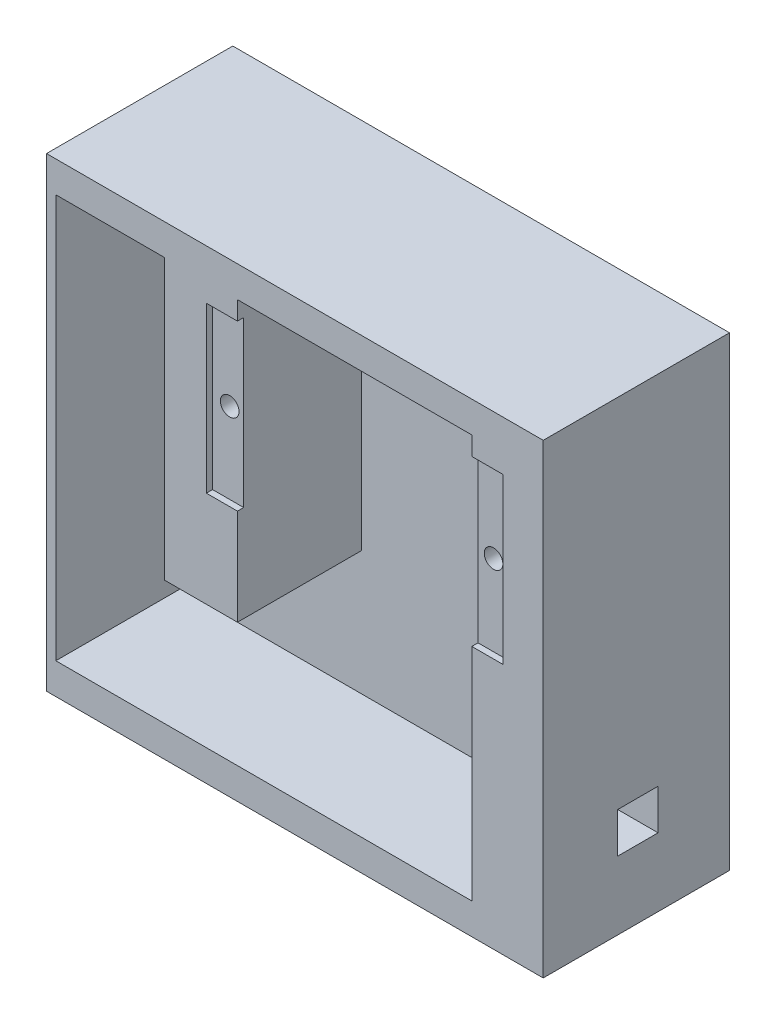
ISO-10303-21;
HEADER;
FILE_DESCRIPTION(('STEP AP214'),'2;1');
FILE_NAME('part.step','',(''),(''),'','','');
FILE_SCHEMA(('AUTOMOTIVE_DESIGN { 1 0 10303 214 1 1 1 1 }'));
ENDSEC;
DATA;
#1=APPLICATION_CONTEXT('core data for automotive mechanical design processes');
#2=APPLICATION_PROTOCOL_DEFINITION('international standard','automotive_design',2000,#1);
#3=PRODUCT_CONTEXT('',#1,'mechanical');
#4=PRODUCT('Part','Part','',(#3));
#5=PRODUCT_RELATED_PRODUCT_CATEGORY('part','',(#4));
#6=PRODUCT_DEFINITION_FORMATION('','',#4);
#7=PRODUCT_DEFINITION_CONTEXT('part definition',#1,'design');
#8=PRODUCT_DEFINITION('design','',#6,#7);
#9=PRODUCT_DEFINITION_SHAPE('','',#8);
#10=(LENGTH_UNIT() NAMED_UNIT(*) SI_UNIT(.MILLI.,.METRE.));
#11=(NAMED_UNIT(*) PLANE_ANGLE_UNIT() SI_UNIT($,.RADIAN.));
#12=(NAMED_UNIT(*) SI_UNIT($,.STERADIAN.) SOLID_ANGLE_UNIT());
#13=UNCERTAINTY_MEASURE_WITH_UNIT(LENGTH_MEASURE(1.E-05),#10,'distance_accuracy_value','');
#14=(GEOMETRIC_REPRESENTATION_CONTEXT(3) GLOBAL_UNCERTAINTY_ASSIGNED_CONTEXT((#13)) GLOBAL_UNIT_ASSIGNED_CONTEXT((#10,
#11,#12)) REPRESENTATION_CONTEXT('',''));
#15=CARTESIAN_POINT('',(0.,0.,0.));
#16=DIRECTION('',(0.,0.,1.));
#17=DIRECTION('',(1.,0.,0.));
#18=AXIS2_PLACEMENT_3D('',#15,#16,#17);
#19=CARTESIAN_POINT('',(-18.,-43.,-8.4852813742386));
#20=DIRECTION('',(0.,0.,1.));
#21=DIRECTION('',(1.,0.,0.));
#22=AXIS2_PLACEMENT_3D('',#19,#20,#21);
#23=CYLINDRICAL_SURFACE('',#22,3.);
#24=CARTESIAN_POINT('',(-18.,-43.,0.));
#25=DIRECTION('',(0.,0.,-1.));
#26=DIRECTION('',(-1.,0.,0.));
#27=AXIS2_PLACEMENT_3D('',#24,#25,#26);
#28=CIRCLE('',#27,3.);
#29=CARTESIAN_POINT('',(-21.,-43.,0.));
#30=VERTEX_POINT('',#29);
#31=EDGE_CURVE('E298',#30,#30,#28,.F.);
#32=ORIENTED_EDGE('',*,*,#31,.F.);
#33=EDGE_LOOP('',(#32));
#34=FACE_BOUND('',#33,.T.);
#35=CARTESIAN_POINT('',(-18.,-43.,58.));
#36=DIRECTION('',(0.,0.,1.));
#37=DIRECTION('',(1.,0.,0.));
#38=AXIS2_PLACEMENT_3D('',#35,#36,#37);
#39=CIRCLE('',#38,3.);
#40=CARTESIAN_POINT('',(-15.,-43.,58.));
#41=VERTEX_POINT('',#40);
#42=EDGE_CURVE('E38',#41,#41,#39,.F.);
#43=ORIENTED_EDGE('',*,*,#42,.F.);
#44=EDGE_LOOP('',(#43));
#45=FACE_BOUND('',#44,.T.);
#46=ADVANCED_FACE('F34',(#34,#45),#23,.F.);
#47=CARTESIAN_POINT('',(-103.,-43.,-8.4852813742386));
#48=DIRECTION('',(0.,0.,1.));
#49=DIRECTION('',(1.,0.,0.));
#50=AXIS2_PLACEMENT_3D('',#47,#48,#49);
#51=CYLINDRICAL_SURFACE('',#50,2.99999999999999);
#52=CARTESIAN_POINT('',(-103.,-43.,0.));
#53=DIRECTION('',(0.,0.,-1.));
#54=DIRECTION('',(-1.,0.,0.));
#55=AXIS2_PLACEMENT_3D('',#52,#53,#54);
#56=CIRCLE('',#55,2.99999999999999);
#57=CARTESIAN_POINT('',(-106.,-43.,0.));
#58=VERTEX_POINT('',#57);
#59=EDGE_CURVE('E305',#58,#58,#56,.F.);
#60=ORIENTED_EDGE('',*,*,#59,.F.);
#61=EDGE_LOOP('',(#60));
#62=FACE_BOUND('',#61,.T.);
#63=CARTESIAN_POINT('',(-103.,-43.,58.));
#64=DIRECTION('',(0.,0.,1.));
#65=DIRECTION('',(1.,0.,0.));
#66=AXIS2_PLACEMENT_3D('',#63,#64,#65);
#67=CIRCLE('',#66,2.99999999999999);
#68=CARTESIAN_POINT('',(-100.,-43.,58.));
#69=VERTEX_POINT('',#68);
#70=EDGE_CURVE('E254',#69,#69,#67,.F.);
#71=ORIENTED_EDGE('',*,*,#70,.F.);
#72=EDGE_LOOP('',(#71));
#73=FACE_BOUND('',#72,.T.);
#74=ADVANCED_FACE('F401',(#62,#73),#51,.F.);
#75=CARTESIAN_POINT('',(0.,0.,60.));
#76=DIRECTION('',(-1.,0.,0.));
#77=DIRECTION('',(0.,-1.,0.));
#78=AXIS2_PLACEMENT_3D('',#75,#76,#77);
#79=PLANE('',#78);
#80=DIRECTION('',(0.,0.,-1.));
#81=VECTOR('',#80,1.);
#82=CARTESIAN_POINT('',(0.,-128.,36.));
#83=LINE('',#82,#81);
#84=CARTESIAN_POINT('',(0.,-128.,36.));
#85=VERTEX_POINT('',#84);
#86=CARTESIAN_POINT('',(0.,-128.,23.));
#87=VERTEX_POINT('',#86);
#88=EDGE_CURVE('E286',#85,#87,#83,.T.);
#89=ORIENTED_EDGE('',*,*,#88,.F.);
#90=DIRECTION('',(0.,-1.,0.));
#91=VECTOR('',#90,1.);
#92=CARTESIAN_POINT('',(0.,-115.,36.));
#93=LINE('',#92,#91);
#94=CARTESIAN_POINT('',(0.,-115.,36.));
#95=VERTEX_POINT('',#94);
#96=EDGE_CURVE('E284',#95,#85,#93,.T.);
#97=ORIENTED_EDGE('',*,*,#96,.F.);
#98=DIRECTION('',(0.,0.,1.));
#99=VECTOR('',#98,1.);
#100=CARTESIAN_POINT('',(0.,-115.,36.));
#101=LINE('',#100,#99);
#102=CARTESIAN_POINT('',(0.,-115.,23.));
#103=VERTEX_POINT('',#102);
#104=EDGE_CURVE('E292',#103,#95,#101,.T.);
#105=ORIENTED_EDGE('',*,*,#104,.F.);
#106=DIRECTION('',(0.,1.,0.));
#107=VECTOR('',#106,1.);
#108=CARTESIAN_POINT('',(0.,-115.,23.));
#109=LINE('',#108,#107);
#110=EDGE_CURVE('E289',#87,#103,#109,.T.);
#111=ORIENTED_EDGE('',*,*,#110,.F.);
#112=EDGE_LOOP('',(#89,#97,#105,#111));
#113=FACE_BOUND('',#112,.T.);
#114=DIRECTION('',(0.,1.,0.));
#115=VECTOR('',#114,1.);
#116=CARTESIAN_POINT('',(0.,0.,0.));
#117=LINE('',#116,#115);
#118=CARTESIAN_POINT('',(0.,-150.,0.));
#119=VERTEX_POINT('',#118);
#120=CARTESIAN_POINT('',(0.,0.,0.));
#121=VERTEX_POINT('',#120);
#122=EDGE_CURVE('E345',#119,#121,#117,.T.);
#123=ORIENTED_EDGE('',*,*,#122,.T.);
#124=DIRECTION('',(0.,0.,-1.));
#125=VECTOR('',#124,1.);
#126=CARTESIAN_POINT('',(0.,0.,60.));
#127=LINE('',#126,#125);
#128=CARTESIAN_POINT('',(0.,0.,60.));
#129=VERTEX_POINT('',#128);
#130=EDGE_CURVE('E382',#129,#121,#127,.T.);
#131=ORIENTED_EDGE('',*,*,#130,.F.);
#132=DIRECTION('',(0.,1.,0.));
#133=VECTOR('',#132,1.);
#134=CARTESIAN_POINT('',(0.,0.,60.));
#135=LINE('',#134,#133);
#136=CARTESIAN_POINT('',(0.,-150.,60.));
#137=VERTEX_POINT('',#136);
#138=EDGE_CURVE('E356',#137,#129,#135,.T.);
#139=ORIENTED_EDGE('',*,*,#138,.F.);
#140=DIRECTION('',(0.,0.,-1.));
#141=VECTOR('',#140,1.);
#142=CARTESIAN_POINT('',(0.,-150.,60.));
#143=LINE('',#142,#141);
#144=EDGE_CURVE('E366',#137,#119,#143,.T.);
#145=ORIENTED_EDGE('',*,*,#144,.T.);
#146=EDGE_LOOP('',(#123,#131,#139,#145));
#147=FACE_BOUND('',#146,.T.);
#148=ADVANCED_FACE('F36',(#113,#147),#79,.F.);
#149=CARTESIAN_POINT('',(0.,0.,60.));
#150=DIRECTION('',(0.,-1.,0.));
#151=DIRECTION('',(1.,0.,0.));
#152=AXIS2_PLACEMENT_3D('',#149,#150,#151);
#153=PLANE('',#152);
#154=DIRECTION('',(-1.,0.,0.));
#155=VECTOR('',#154,1.);
#156=CARTESIAN_POINT('',(0.,0.,0.));
#157=LINE('',#156,#155);
#158=CARTESIAN_POINT('',(-160.,0.,0.));
#159=VERTEX_POINT('',#158);
#160=EDGE_CURVE('E369',#121,#159,#157,.T.);
#161=ORIENTED_EDGE('',*,*,#160,.T.);
#162=DIRECTION('',(0.,0.,-1.));
#163=VECTOR('',#162,1.);
#164=CARTESIAN_POINT('',(-160.,0.,60.));
#165=LINE('',#164,#163);
#166=CARTESIAN_POINT('',(-160.,0.,60.));
#167=VERTEX_POINT('',#166);
#168=EDGE_CURVE('E379',#167,#159,#165,.T.);
#169=ORIENTED_EDGE('',*,*,#168,.F.);
#170=DIRECTION('',(-1.,0.,0.));
#171=VECTOR('',#170,1.);
#172=CARTESIAN_POINT('',(0.,0.,60.));
#173=LINE('',#172,#171);
#174=EDGE_CURVE('E359',#129,#167,#173,.T.);
#175=ORIENTED_EDGE('',*,*,#174,.F.);
#176=ORIENTED_EDGE('',*,*,#130,.T.);
#177=EDGE_LOOP('',(#161,#169,#175,#176));
#178=FACE_BOUND('',#177,.T.);
#179=ADVANCED_FACE('F453',(#178),#153,.F.);
#180=CARTESIAN_POINT('',(-160.,0.,60.));
#181=DIRECTION('',(1.,0.,0.));
#182=DIRECTION('',(0.,1.,0.));
#183=AXIS2_PLACEMENT_3D('',#180,#181,#182);
#184=PLANE('',#183);
#185=DIRECTION('',(0.,-1.,0.));
#186=VECTOR('',#185,1.);
#187=CARTESIAN_POINT('',(-160.,0.,0.));
#188=LINE('',#187,#186);
#189=CARTESIAN_POINT('',(-160.,-150.,0.));
#190=VERTEX_POINT('',#189);
#191=EDGE_CURVE('E371',#159,#190,#188,.T.);
#192=ORIENTED_EDGE('',*,*,#191,.T.);
#193=DIRECTION('',(0.,0.,-1.));
#194=VECTOR('',#193,1.);
#195=CARTESIAN_POINT('',(-160.,-150.,60.));
#196=LINE('',#195,#194);
#197=CARTESIAN_POINT('',(-160.,-150.,60.));
#198=VERTEX_POINT('',#197);
#199=EDGE_CURVE('E376',#198,#190,#196,.T.);
#200=ORIENTED_EDGE('',*,*,#199,.F.);
#201=DIRECTION('',(0.,-1.,0.));
#202=VECTOR('',#201,1.);
#203=CARTESIAN_POINT('',(-160.,0.,60.));
#204=LINE('',#203,#202);
#205=EDGE_CURVE('E362',#167,#198,#204,.T.);
#206=ORIENTED_EDGE('',*,*,#205,.F.);
#207=ORIENTED_EDGE('',*,*,#168,.T.);
#208=EDGE_LOOP('',(#192,#200,#206,#207));
#209=FACE_BOUND('',#208,.T.);
#210=ADVANCED_FACE('F450',(#209),#184,.F.);
#211=CARTESIAN_POINT('',(0.,-150.,60.));
#212=DIRECTION('',(0.,1.,0.));
#213=DIRECTION('',(-1.,0.,0.));
#214=AXIS2_PLACEMENT_3D('',#211,#212,#213);
#215=PLANE('',#214);
#216=DIRECTION('',(1.,0.,0.));
#217=VECTOR('',#216,1.);
#218=CARTESIAN_POINT('',(0.,-150.,0.));
#219=LINE('',#218,#217);
#220=EDGE_CURVE('E360',#190,#119,#219,.T.);
#221=ORIENTED_EDGE('',*,*,#220,.T.);
#222=ORIENTED_EDGE('',*,*,#144,.F.);
#223=DIRECTION('',(1.,0.,0.));
#224=VECTOR('',#223,1.);
#225=CARTESIAN_POINT('',(0.,-150.,60.));
#226=LINE('',#225,#224);
#227=EDGE_CURVE('E364',#198,#137,#226,.T.);
#228=ORIENTED_EDGE('',*,*,#227,.F.);
#229=ORIENTED_EDGE('',*,*,#199,.T.);
#230=EDGE_LOOP('',(#221,#222,#228,#229));
#231=FACE_BOUND('',#230,.T.);
#232=ADVANCED_FACE('F443',(#231),#215,.F.);
#233=CARTESIAN_POINT('',(0.,0.,60.));
#234=DIRECTION('',(0.,0.,-1.));
#235=DIRECTION('',(-1.,0.,0.));
#236=AXIS2_PLACEMENT_3D('',#233,#234,#235);
#237=PLANE('',#236);
#238=DIRECTION('',(0.,-1.,0.));
#239=VECTOR('',#238,1.);
#240=CARTESIAN_POINT('',(-157.,-100.,60.));
#241=LINE('',#240,#239);
#242=CARTESIAN_POINT('',(-157.,-10.,60.));
#243=VERTEX_POINT('',#242);
#244=CARTESIAN_POINT('',(-157.,-140.,60.));
#245=VERTEX_POINT('',#244);
#246=EDGE_CURVE('E332',#243,#245,#241,.T.);
#247=ORIENTED_EDGE('',*,*,#246,.F.);
#248=DIRECTION('',(-1.,0.,0.));
#249=VECTOR('',#248,1.);
#250=CARTESIAN_POINT('',(-157.,-10.,60.));
#251=LINE('',#250,#249);
#252=CARTESIAN_POINT('',(-122.,-10.,60.));
#253=VERTEX_POINT('',#252);
#254=EDGE_CURVE('E211',#253,#243,#251,.T.);
#255=ORIENTED_EDGE('',*,*,#254,.F.);
#256=DIRECTION('',(0.,1.,0.));
#257=VECTOR('',#256,1.);
#258=CARTESIAN_POINT('',(-122.,-10.,60.));
#259=LINE('',#258,#257);
#260=CARTESIAN_POINT('',(-122.,-100.,60.));
#261=VERTEX_POINT('',#260);
#262=EDGE_CURVE('E217',#261,#253,#259,.T.);
#263=ORIENTED_EDGE('',*,*,#262,.F.);
#264=DIRECTION('',(-1.,0.,0.));
#265=VECTOR('',#264,1.);
#266=CARTESIAN_POINT('',(-157.,-100.,60.));
#267=LINE('',#266,#265);
#268=CARTESIAN_POINT('',(-98.5,-100.,60.));
#269=VERTEX_POINT('',#268);
#270=EDGE_CURVE('E329',#269,#261,#267,.T.);
#271=ORIENTED_EDGE('',*,*,#270,.F.);
#272=DIRECTION('',(0.,-1.,0.));
#273=VECTOR('',#272,1.);
#274=CARTESIAN_POINT('',(-98.5,-10.,60.));
#275=LINE('',#274,#273);
#276=CARTESIAN_POINT('',(-98.5,-69.,60.));
#277=VERTEX_POINT('',#276);
#278=EDGE_CURVE('E308',#277,#269,#275,.T.);
#279=ORIENTED_EDGE('',*,*,#278,.F.);
#280=DIRECTION('',(1.,0.,0.));
#281=VECTOR('',#280,1.);
#282=CARTESIAN_POINT('',(-108.5,-69.,60.));
#283=LINE('',#282,#281);
#284=CARTESIAN_POINT('',(-108.5,-69.,60.));
#285=VERTEX_POINT('',#284);
#286=EDGE_CURVE('E247',#285,#277,#283,.T.);
#287=ORIENTED_EDGE('',*,*,#286,.F.);
#288=DIRECTION('',(0.,-1.,0.));
#289=VECTOR('',#288,1.);
#290=CARTESIAN_POINT('',(-108.5,-16.,60.));
#291=LINE('',#290,#289);
#292=CARTESIAN_POINT('',(-108.5,-16.,60.));
#293=VERTEX_POINT('',#292);
#294=EDGE_CURVE('E244',#293,#285,#291,.T.);
#295=ORIENTED_EDGE('',*,*,#294,.F.);
#296=DIRECTION('',(-1.,0.,0.));
#297=VECTOR('',#296,1.);
#298=CARTESIAN_POINT('',(-108.5,-16.,60.));
#299=LINE('',#298,#297);
#300=CARTESIAN_POINT('',(-98.5,-16.,60.));
#301=VERTEX_POINT('',#300);
#302=EDGE_CURVE('E236',#301,#293,#299,.T.);
#303=ORIENTED_EDGE('',*,*,#302,.F.);
#304=CARTESIAN_POINT('',(-98.5,-10.,60.));
#305=VERTEX_POINT('',#304);
#306=EDGE_CURVE('E326',#305,#301,#275,.T.);
#307=ORIENTED_EDGE('',*,*,#306,.F.);
#308=DIRECTION('',(-1.,0.,0.));
#309=VECTOR('',#308,1.);
#310=CARTESIAN_POINT('',(-98.5,-10.,60.));
#311=LINE('',#310,#309);
#312=CARTESIAN_POINT('',(-23.,-10.,60.));
#313=VERTEX_POINT('',#312);
#314=EDGE_CURVE('E313',#313,#305,#311,.T.);
#315=ORIENTED_EDGE('',*,*,#314,.F.);
#316=DIRECTION('',(0.,1.,0.));
#317=VECTOR('',#316,1.);
#318=CARTESIAN_POINT('',(-23.,-10.,60.));
#319=LINE('',#318,#317);
#320=CARTESIAN_POINT('',(-23.,-16.,60.));
#321=VERTEX_POINT('',#320);
#322=EDGE_CURVE('E337',#321,#313,#319,.T.);
#323=ORIENTED_EDGE('',*,*,#322,.F.);
#324=DIRECTION('',(-1.,0.,0.));
#325=VECTOR('',#324,1.);
#326=CARTESIAN_POINT('',(-23.,-16.,60.));
#327=LINE('',#326,#325);
#328=CARTESIAN_POINT('',(-13.,-16.,60.));
#329=VERTEX_POINT('',#328);
#330=EDGE_CURVE('E264',#329,#321,#327,.T.);
#331=ORIENTED_EDGE('',*,*,#330,.F.);
#332=DIRECTION('',(0.,1.,0.));
#333=VECTOR('',#332,1.);
#334=CARTESIAN_POINT('',(-13.,-16.,60.));
#335=LINE('',#334,#333);
#336=CARTESIAN_POINT('',(-13.,-69.,60.));
#337=VERTEX_POINT('',#336);
#338=EDGE_CURVE('E273',#337,#329,#335,.T.);
#339=ORIENTED_EDGE('',*,*,#338,.F.);
#340=DIRECTION('',(1.,0.,0.));
#341=VECTOR('',#340,1.);
#342=CARTESIAN_POINT('',(-23.,-69.,60.));
#343=LINE('',#342,#341);
#344=CARTESIAN_POINT('',(-23.,-69.,60.));
#345=VERTEX_POINT('',#344);
#346=EDGE_CURVE('E233',#345,#337,#343,.T.);
#347=ORIENTED_EDGE('',*,*,#346,.F.);
#348=CARTESIAN_POINT('',(-23.,-140.,60.));
#349=VERTEX_POINT('',#348);
#350=EDGE_CURVE('E338',#349,#345,#319,.T.);
#351=ORIENTED_EDGE('',*,*,#350,.F.);
#352=DIRECTION('',(1.,0.,0.));
#353=VECTOR('',#352,1.);
#354=CARTESIAN_POINT('',(-157.,-140.,60.));
#355=LINE('',#354,#353);
#356=EDGE_CURVE('E335',#245,#349,#355,.T.);
#357=ORIENTED_EDGE('',*,*,#356,.F.);
#358=EDGE_LOOP('',(#247,#255,#263,#271,#279,#287,#295,#303,#307,#315,#323,#331,#339,#347,#351,#357));
#359=FACE_BOUND('',#358,.T.);
#360=ORIENTED_EDGE('',*,*,#138,.T.);
#361=ORIENTED_EDGE('',*,*,#174,.T.);
#362=ORIENTED_EDGE('',*,*,#205,.T.);
#363=ORIENTED_EDGE('',*,*,#227,.T.);
#364=EDGE_LOOP('',(#360,#361,#362,#363));
#365=FACE_BOUND('',#364,.T.);
#366=ADVANCED_FACE('F440',(#359,#365),#237,.F.);
#367=CARTESIAN_POINT('',(0.,0.,0.));
#368=DIRECTION('',(0.,0.,-1.));
#369=DIRECTION('',(-1.,0.,0.));
#370=AXIS2_PLACEMENT_3D('',#367,#368,#369);
#371=PLANE('',#370);
#372=ORIENTED_EDGE('',*,*,#59,.T.);
#373=EDGE_LOOP('',(#372));
#374=FACE_BOUND('',#373,.T.);
#375=ORIENTED_EDGE('',*,*,#31,.T.);
#376=EDGE_LOOP('',(#375));
#377=FACE_BOUND('',#376,.T.);
#378=ORIENTED_EDGE('',*,*,#122,.F.);
#379=ORIENTED_EDGE('',*,*,#220,.F.);
#380=ORIENTED_EDGE('',*,*,#191,.F.);
#381=ORIENTED_EDGE('',*,*,#160,.F.);
#382=EDGE_LOOP('',(#378,#379,#380,#381));
#383=FACE_BOUND('',#382,.T.);
#384=ADVANCED_FACE('F438',(#374,#377,#383),#371,.T.);
#385=CARTESIAN_POINT('',(-98.5,-10.,20.));
#386=DIRECTION('',(-1.,0.,0.));
#387=DIRECTION('',(0.,-1.,0.));
#388=AXIS2_PLACEMENT_3D('',#385,#386,#387);
#389=PLANE('',#388);
#390=ORIENTED_EDGE('',*,*,#306,.T.);
#391=DIRECTION('',(0.,0.,1.));
#392=VECTOR('',#391,1.);
#393=CARTESIAN_POINT('',(-98.5,-16.,58.));
#394=LINE('',#393,#392);
#395=CARTESIAN_POINT('',(-98.5,-16.,58.));
#396=VERTEX_POINT('',#395);
#397=EDGE_CURVE('E255',#396,#301,#394,.T.);
#398=ORIENTED_EDGE('',*,*,#397,.F.);
#399=DIRECTION('',(0.,1.,0.));
#400=VECTOR('',#399,1.);
#401=CARTESIAN_POINT('',(-98.5,-16.,58.));
#402=LINE('',#401,#400);
#403=CARTESIAN_POINT('',(-98.5,-69.,58.));
#404=VERTEX_POINT('',#403);
#405=EDGE_CURVE('E238',#404,#396,#402,.T.);
#406=ORIENTED_EDGE('',*,*,#405,.F.);
#407=DIRECTION('',(0.,0.,1.));
#408=VECTOR('',#407,1.);
#409=CARTESIAN_POINT('',(-98.5,-69.,58.));
#410=LINE('',#409,#408);
#411=EDGE_CURVE('E257',#404,#277,#410,.T.);
#412=ORIENTED_EDGE('',*,*,#411,.T.);
#413=ORIENTED_EDGE('',*,*,#278,.T.);
#414=DIRECTION('',(0.,0.,1.));
#415=VECTOR('',#414,1.);
#416=CARTESIAN_POINT('',(-98.5,-100.,20.));
#417=LINE('',#416,#415);
#418=CARTESIAN_POINT('',(-98.5,-100.,20.));
#419=VERTEX_POINT('',#418);
#420=EDGE_CURVE('E325',#419,#269,#417,.T.);
#421=ORIENTED_EDGE('',*,*,#420,.F.);
#422=DIRECTION('',(0.,-1.,0.));
#423=VECTOR('',#422,1.);
#424=CARTESIAN_POINT('',(-98.5,-10.,20.));
#425=LINE('',#424,#423);
#426=CARTESIAN_POINT('',(-98.5,-10.,20.));
#427=VERTEX_POINT('',#426);
#428=EDGE_CURVE('E311',#427,#419,#425,.T.);
#429=ORIENTED_EDGE('',*,*,#428,.F.);
#430=DIRECTION('',(0.,0.,1.));
#431=VECTOR('',#430,1.);
#432=CARTESIAN_POINT('',(-98.5,-10.,20.));
#433=LINE('',#432,#431);
#434=EDGE_CURVE('E343',#427,#305,#433,.T.);
#435=ORIENTED_EDGE('',*,*,#434,.T.);
#436=EDGE_LOOP('',(#390,#398,#406,#412,#413,#421,#429,#435));
#437=FACE_BOUND('',#436,.T.);
#438=ADVANCED_FACE('F420',(#437),#389,.F.);
#439=CARTESIAN_POINT('',(-98.5,-10.,20.));
#440=DIRECTION('',(0.,1.,0.));
#441=DIRECTION('',(0.,0.,1.));
#442=AXIS2_PLACEMENT_3D('',#439,#440,#441);
#443=PLANE('',#442);
#444=ORIENTED_EDGE('',*,*,#314,.T.);
#445=ORIENTED_EDGE('',*,*,#434,.F.);
#446=DIRECTION('',(-1.,0.,0.));
#447=VECTOR('',#446,1.);
#448=CARTESIAN_POINT('',(-98.5,-10.,20.));
#449=LINE('',#448,#447);
#450=CARTESIAN_POINT('',(-23.,-10.,20.));
#451=VERTEX_POINT('',#450);
#452=EDGE_CURVE('E322',#451,#427,#449,.T.);
#453=ORIENTED_EDGE('',*,*,#452,.F.);
#454=DIRECTION('',(0.,0.,1.));
#455=VECTOR('',#454,1.);
#456=CARTESIAN_POINT('',(-23.,-10.,20.));
#457=LINE('',#456,#455);
#458=EDGE_CURVE('E346',#451,#313,#457,.T.);
#459=ORIENTED_EDGE('',*,*,#458,.T.);
#460=EDGE_LOOP('',(#444,#445,#453,#459));
#461=FACE_BOUND('',#460,.T.);
#462=ADVANCED_FACE('F416',(#461),#443,.F.);
#463=CARTESIAN_POINT('',(-23.,-10.,20.));
#464=DIRECTION('',(1.,0.,0.));
#465=DIRECTION('',(0.,1.,0.));
#466=AXIS2_PLACEMENT_3D('',#463,#464,#465);
#467=PLANE('',#466);
#468=DIRECTION('',(0.,0.,1.));
#469=VECTOR('',#468,1.);
#470=CARTESIAN_POINT('',(-23.,-115.,20.));
#471=LINE('',#470,#469);
#472=CARTESIAN_POINT('',(-23.,-115.,23.));
#473=VERTEX_POINT('',#472);
#474=CARTESIAN_POINT('',(-23.,-115.,36.));
#475=VERTEX_POINT('',#474);
#476=EDGE_CURVE('E43',#473,#475,#471,.T.);
#477=ORIENTED_EDGE('',*,*,#476,.T.);
#478=DIRECTION('',(0.,-1.,0.));
#479=VECTOR('',#478,1.);
#480=CARTESIAN_POINT('',(-23.,-10.,36.));
#481=LINE('',#480,#479);
#482=CARTESIAN_POINT('',(-23.,-128.,36.));
#483=VERTEX_POINT('',#482);
#484=EDGE_CURVE('E11',#475,#483,#481,.T.);
#485=ORIENTED_EDGE('',*,*,#484,.T.);
#486=DIRECTION('',(0.,0.,-1.));
#487=VECTOR('',#486,1.);
#488=CARTESIAN_POINT('',(-23.,-128.,20.));
#489=LINE('',#488,#487);
#490=CARTESIAN_POINT('',(-23.,-128.,23.));
#491=VERTEX_POINT('',#490);
#492=EDGE_CURVE('E385',#483,#491,#489,.T.);
#493=ORIENTED_EDGE('',*,*,#492,.T.);
#494=DIRECTION('',(0.,1.,0.));
#495=VECTOR('',#494,1.);
#496=CARTESIAN_POINT('',(-23.,-10.,23.));
#497=LINE('',#496,#495);
#498=EDGE_CURVE('E388',#491,#473,#497,.T.);
#499=ORIENTED_EDGE('',*,*,#498,.T.);
#500=EDGE_LOOP('',(#477,#485,#493,#499));
#501=FACE_BOUND('',#500,.T.);
#502=DIRECTION('',(0.,-1.,0.));
#503=VECTOR('',#502,1.);
#504=CARTESIAN_POINT('',(-23.,-16.,58.));
#505=LINE('',#504,#503);
#506=CARTESIAN_POINT('',(-23.,-16.,58.));
#507=VERTEX_POINT('',#506);
#508=CARTESIAN_POINT('',(-23.,-69.,58.));
#509=VERTEX_POINT('',#508);
#510=EDGE_CURVE('E261',#507,#509,#505,.T.);
#511=ORIENTED_EDGE('',*,*,#510,.F.);
#512=DIRECTION('',(0.,0.,1.));
#513=VECTOR('',#512,1.);
#514=CARTESIAN_POINT('',(-23.,-16.,58.));
#515=LINE('',#514,#513);
#516=EDGE_CURVE('E248',#507,#321,#515,.T.);
#517=ORIENTED_EDGE('',*,*,#516,.T.);
#518=ORIENTED_EDGE('',*,*,#322,.T.);
#519=ORIENTED_EDGE('',*,*,#458,.F.);
#520=DIRECTION('',(0.,1.,0.));
#521=VECTOR('',#520,1.);
#522=CARTESIAN_POINT('',(-23.,-10.,20.));
#523=LINE('',#522,#521);
#524=CARTESIAN_POINT('',(-23.,-140.,20.));
#525=VERTEX_POINT('',#524);
#526=EDGE_CURVE('E319',#525,#451,#523,.T.);
#527=ORIENTED_EDGE('',*,*,#526,.F.);
#528=DIRECTION('',(0.,0.,1.));
#529=VECTOR('',#528,1.);
#530=CARTESIAN_POINT('',(-23.,-140.,20.));
#531=LINE('',#530,#529);
#532=EDGE_CURVE('E349',#525,#349,#531,.T.);
#533=ORIENTED_EDGE('',*,*,#532,.T.);
#534=ORIENTED_EDGE('',*,*,#350,.T.);
#535=DIRECTION('',(0.,0.,1.));
#536=VECTOR('',#535,1.);
#537=CARTESIAN_POINT('',(-23.,-69.,58.));
#538=LINE('',#537,#536);
#539=EDGE_CURVE('E270',#509,#345,#538,.T.);
#540=ORIENTED_EDGE('',*,*,#539,.F.);
#541=EDGE_LOOP('',(#511,#517,#518,#519,#527,#533,#534,#540));
#542=FACE_BOUND('',#541,.T.);
#543=ADVANCED_FACE('F419',(#501,#542),#467,.F.);
#544=CARTESIAN_POINT('',(-157.,-140.,20.));
#545=DIRECTION('',(0.,-1.,0.));
#546=DIRECTION('',(0.,0.,-1.));
#547=AXIS2_PLACEMENT_3D('',#544,#545,#546);
#548=PLANE('',#547);
#549=ORIENTED_EDGE('',*,*,#532,.F.);
#550=DIRECTION('',(1.,0.,0.));
#551=VECTOR('',#550,1.);
#552=CARTESIAN_POINT('',(-157.,-140.,20.));
#553=LINE('',#552,#551);
#554=CARTESIAN_POINT('',(-157.,-140.,20.));
#555=VERTEX_POINT('',#554);
#556=EDGE_CURVE('E317',#555,#525,#553,.T.);
#557=ORIENTED_EDGE('',*,*,#556,.F.);
#558=DIRECTION('',(0.,0.,1.));
#559=VECTOR('',#558,1.);
#560=CARTESIAN_POINT('',(-157.,-140.,20.));
#561=LINE('',#560,#559);
#562=EDGE_CURVE('E352',#555,#245,#561,.T.);
#563=ORIENTED_EDGE('',*,*,#562,.T.);
#564=ORIENTED_EDGE('',*,*,#356,.T.);
#565=EDGE_LOOP('',(#549,#557,#563,#564));
#566=FACE_BOUND('',#565,.T.);
#567=ADVANCED_FACE('F424',(#566),#548,.F.);
#568=CARTESIAN_POINT('',(-157.,-100.,20.));
#569=DIRECTION('',(-1.,0.,0.));
#570=DIRECTION('',(0.,0.,1.));
#571=AXIS2_PLACEMENT_3D('',#568,#569,#570);
#572=PLANE('',#571);
#573=ORIENTED_EDGE('',*,*,#246,.T.);
#574=ORIENTED_EDGE('',*,*,#562,.F.);
#575=DIRECTION('',(0.,-1.,0.));
#576=VECTOR('',#575,1.);
#577=CARTESIAN_POINT('',(-157.,-100.,20.));
#578=LINE('',#577,#576);
#579=CARTESIAN_POINT('',(-157.,-10.,20.));
#580=VERTEX_POINT('',#579);
#581=EDGE_CURVE('E315',#580,#555,#578,.T.);
#582=ORIENTED_EDGE('',*,*,#581,.F.);
#583=DIRECTION('',(0.,0.,1.));
#584=VECTOR('',#583,1.);
#585=CARTESIAN_POINT('',(-157.,-10.,20.));
#586=LINE('',#585,#584);
#587=EDGE_CURVE('E221',#580,#243,#586,.T.);
#588=ORIENTED_EDGE('',*,*,#587,.T.);
#589=EDGE_LOOP('',(#573,#574,#582,#588));
#590=FACE_BOUND('',#589,.T.);
#591=ADVANCED_FACE('F428',(#590),#572,.F.);
#592=CARTESIAN_POINT('',(-157.,-100.,20.));
#593=DIRECTION('',(0.,1.,0.));
#594=DIRECTION('',(0.,0.,1.));
#595=AXIS2_PLACEMENT_3D('',#592,#593,#594);
#596=PLANE('',#595);
#597=ORIENTED_EDGE('',*,*,#270,.T.);
#598=DIRECTION('',(0.,0.,-1.));
#599=VECTOR('',#598,1.);
#600=CARTESIAN_POINT('',(-122.,-100.,20.));
#601=LINE('',#600,#599);
#602=CARTESIAN_POINT('',(-122.,-100.,20.));
#603=VERTEX_POINT('',#602);
#604=EDGE_CURVE('E230',#261,#603,#601,.T.);
#605=ORIENTED_EDGE('',*,*,#604,.T.);
#606=DIRECTION('',(-1.,0.,0.));
#607=VECTOR('',#606,1.);
#608=CARTESIAN_POINT('',(-157.,-100.,20.));
#609=LINE('',#608,#607);
#610=EDGE_CURVE('E208',#419,#603,#609,.T.);
#611=ORIENTED_EDGE('',*,*,#610,.F.);
#612=ORIENTED_EDGE('',*,*,#420,.T.);
#613=EDGE_LOOP('',(#597,#605,#611,#612));
#614=FACE_BOUND('',#613,.T.);
#615=ADVANCED_FACE('F415',(#614),#596,.F.);
#616=CARTESIAN_POINT('',(0.,0.,20.));
#617=DIRECTION('',(0.,0.,1.));
#618=DIRECTION('',(1.,0.,0.));
#619=AXIS2_PLACEMENT_3D('',#616,#617,#618);
#620=PLANE('',#619);
#621=ORIENTED_EDGE('',*,*,#610,.T.);
#622=DIRECTION('',(0.,1.,0.));
#623=VECTOR('',#622,1.);
#624=CARTESIAN_POINT('',(-122.,-10.,20.));
#625=LINE('',#624,#623);
#626=CARTESIAN_POINT('',(-122.,-10.,20.));
#627=VERTEX_POINT('',#626);
#628=EDGE_CURVE('E200',#603,#627,#625,.T.);
#629=ORIENTED_EDGE('',*,*,#628,.T.);
#630=DIRECTION('',(-1.,0.,0.));
#631=VECTOR('',#630,1.);
#632=CARTESIAN_POINT('',(-157.,-10.,20.));
#633=LINE('',#632,#631);
#634=EDGE_CURVE('E205',#627,#580,#633,.T.);
#635=ORIENTED_EDGE('',*,*,#634,.T.);
#636=ORIENTED_EDGE('',*,*,#581,.T.);
#637=ORIENTED_EDGE('',*,*,#556,.T.);
#638=ORIENTED_EDGE('',*,*,#526,.T.);
#639=ORIENTED_EDGE('',*,*,#452,.T.);
#640=ORIENTED_EDGE('',*,*,#428,.T.);
#641=EDGE_LOOP('',(#621,#629,#635,#636,#637,#638,#639,#640));
#642=FACE_BOUND('',#641,.T.);
#643=ADVANCED_FACE('F202',(#642),#620,.T.);
#644=CARTESIAN_POINT('',(-50.,-115.,36.));
#645=DIRECTION('',(0.,0.,1.));
#646=DIRECTION('',(1.,0.,0.));
#647=AXIS2_PLACEMENT_3D('',#644,#645,#646);
#648=PLANE('',#647);
#649=DIRECTION('',(1.,0.,0.));
#650=VECTOR('',#649,1.);
#651=CARTESIAN_POINT('',(-50.,-115.,36.));
#652=LINE('',#651,#650);
#653=EDGE_CURVE('E296',#475,#95,#652,.T.);
#654=ORIENTED_EDGE('',*,*,#653,.T.);
#655=ORIENTED_EDGE('',*,*,#96,.T.);
#656=DIRECTION('',(1.,0.,0.));
#657=VECTOR('',#656,1.);
#658=CARTESIAN_POINT('',(-50.,-128.,36.));
#659=LINE('',#658,#657);
#660=EDGE_CURVE('E295',#483,#85,#659,.T.);
#661=ORIENTED_EDGE('',*,*,#660,.F.);
#662=ORIENTED_EDGE('',*,*,#484,.F.);
#663=EDGE_LOOP('',(#654,#655,#661,#662));
#664=FACE_BOUND('',#663,.T.);
#665=ADVANCED_FACE('F414',(#664),#648,.F.);
#666=CARTESIAN_POINT('',(-50.,-115.,36.));
#667=DIRECTION('',(0.,1.,0.));
#668=DIRECTION('',(-1.,0.,0.));
#669=AXIS2_PLACEMENT_3D('',#666,#667,#668);
#670=PLANE('',#669);
#671=DIRECTION('',(1.,0.,0.));
#672=VECTOR('',#671,1.);
#673=CARTESIAN_POINT('',(-50.,-115.,23.));
#674=LINE('',#673,#672);
#675=EDGE_CURVE('E299',#473,#103,#674,.T.);
#676=ORIENTED_EDGE('',*,*,#675,.T.);
#677=ORIENTED_EDGE('',*,*,#104,.T.);
#678=ORIENTED_EDGE('',*,*,#653,.F.);
#679=ORIENTED_EDGE('',*,*,#476,.F.);
#680=EDGE_LOOP('',(#676,#677,#678,#679));
#681=FACE_BOUND('',#680,.T.);
#682=ADVANCED_FACE('F489',(#681),#670,.F.);
#683=CARTESIAN_POINT('',(-50.,-115.,23.));
#684=DIRECTION('',(0.,0.,-1.));
#685=DIRECTION('',(0.,1.,0.));
#686=AXIS2_PLACEMENT_3D('',#683,#684,#685);
#687=PLANE('',#686);
#688=DIRECTION('',(1.,0.,0.));
#689=VECTOR('',#688,1.);
#690=CARTESIAN_POINT('',(-50.,-128.,23.));
#691=LINE('',#690,#689);
#692=EDGE_CURVE('E301',#491,#87,#691,.T.);
#693=ORIENTED_EDGE('',*,*,#692,.T.);
#694=ORIENTED_EDGE('',*,*,#110,.T.);
#695=ORIENTED_EDGE('',*,*,#675,.F.);
#696=ORIENTED_EDGE('',*,*,#498,.F.);
#697=EDGE_LOOP('',(#693,#694,#695,#696));
#698=FACE_BOUND('',#697,.T.);
#699=ADVANCED_FACE('F491',(#698),#687,.F.);
#700=CARTESIAN_POINT('',(-50.,-128.,36.));
#701=DIRECTION('',(0.,-1.,0.));
#702=DIRECTION('',(1.,0.,0.));
#703=AXIS2_PLACEMENT_3D('',#700,#701,#702);
#704=PLANE('',#703);
#705=ORIENTED_EDGE('',*,*,#660,.T.);
#706=ORIENTED_EDGE('',*,*,#88,.T.);
#707=ORIENTED_EDGE('',*,*,#692,.F.);
#708=ORIENTED_EDGE('',*,*,#492,.F.);
#709=EDGE_LOOP('',(#705,#706,#707,#708));
#710=FACE_BOUND('',#709,.T.);
#711=ADVANCED_FACE('F481',(#710),#704,.F.);
#712=CARTESIAN_POINT('',(0.,0.,58.));
#713=DIRECTION('',(0.,0.,1.));
#714=DIRECTION('',(1.,0.,0.));
#715=AXIS2_PLACEMENT_3D('',#712,#713,#714);
#716=PLANE('',#715);
#717=DIRECTION('',(0.,-1.,0.));
#718=VECTOR('',#717,1.);
#719=CARTESIAN_POINT('',(-108.5,-16.,58.));
#720=LINE('',#719,#718);
#721=CARTESIAN_POINT('',(-108.5,-16.,58.));
#722=VERTEX_POINT('',#721);
#723=CARTESIAN_POINT('',(-108.5,-69.,58.));
#724=VERTEX_POINT('',#723);
#725=EDGE_CURVE('E234',#722,#724,#720,.T.);
#726=ORIENTED_EDGE('',*,*,#725,.T.);
#727=DIRECTION('',(1.,0.,0.));
#728=VECTOR('',#727,1.);
#729=CARTESIAN_POINT('',(-108.5,-69.,58.));
#730=LINE('',#729,#728);
#731=EDGE_CURVE('E51',#724,#404,#730,.T.);
#732=ORIENTED_EDGE('',*,*,#731,.T.);
#733=ORIENTED_EDGE('',*,*,#405,.T.);
#734=DIRECTION('',(-1.,0.,0.));
#735=VECTOR('',#734,1.);
#736=CARTESIAN_POINT('',(-108.5,-16.,58.));
#737=LINE('',#736,#735);
#738=EDGE_CURVE('E240',#396,#722,#737,.T.);
#739=ORIENTED_EDGE('',*,*,#738,.T.);
#740=EDGE_LOOP('',(#726,#732,#733,#739));
#741=FACE_BOUND('',#740,.T.);
#742=ORIENTED_EDGE('',*,*,#70,.T.);
#743=EDGE_LOOP('',(#742));
#744=FACE_BOUND('',#743,.T.);
#745=ADVANCED_FACE('F498',(#741,#744),#716,.T.);
#746=CARTESIAN_POINT('',(-108.5,-16.,58.));
#747=DIRECTION('',(-1.,0.,0.));
#748=DIRECTION('',(0.,0.,1.));
#749=AXIS2_PLACEMENT_3D('',#746,#747,#748);
#750=PLANE('',#749);
#751=ORIENTED_EDGE('',*,*,#294,.T.);
#752=DIRECTION('',(0.,0.,1.));
#753=VECTOR('',#752,1.);
#754=CARTESIAN_POINT('',(-108.5,-69.,58.));
#755=LINE('',#754,#753);
#756=EDGE_CURVE('E243',#724,#285,#755,.T.);
#757=ORIENTED_EDGE('',*,*,#756,.F.);
#758=ORIENTED_EDGE('',*,*,#725,.F.);
#759=DIRECTION('',(0.,0.,1.));
#760=VECTOR('',#759,1.);
#761=CARTESIAN_POINT('',(-108.5,-16.,58.));
#762=LINE('',#761,#760);
#763=EDGE_CURVE('E252',#722,#293,#762,.T.);
#764=ORIENTED_EDGE('',*,*,#763,.T.);
#765=EDGE_LOOP('',(#751,#757,#758,#764));
#766=FACE_BOUND('',#765,.T.);
#767=ADVANCED_FACE('F555',(#766),#750,.F.);
#768=CARTESIAN_POINT('',(-108.5,-16.,58.));
#769=DIRECTION('',(0.,1.,0.));
#770=DIRECTION('',(-1.,0.,0.));
#771=AXIS2_PLACEMENT_3D('',#768,#769,#770);
#772=PLANE('',#771);
#773=ORIENTED_EDGE('',*,*,#302,.T.);
#774=ORIENTED_EDGE('',*,*,#763,.F.);
#775=ORIENTED_EDGE('',*,*,#738,.F.);
#776=ORIENTED_EDGE('',*,*,#397,.T.);
#777=EDGE_LOOP('',(#773,#774,#775,#776));
#778=FACE_BOUND('',#777,.T.);
#779=ADVANCED_FACE('F564',(#778),#772,.F.);
#780=CARTESIAN_POINT('',(-108.5,-69.,58.));
#781=DIRECTION('',(0.,-1.,0.));
#782=DIRECTION('',(0.,0.,-1.));
#783=AXIS2_PLACEMENT_3D('',#780,#781,#782);
#784=PLANE('',#783);
#785=ORIENTED_EDGE('',*,*,#286,.T.);
#786=ORIENTED_EDGE('',*,*,#411,.F.);
#787=ORIENTED_EDGE('',*,*,#731,.F.);
#788=ORIENTED_EDGE('',*,*,#756,.T.);
#789=EDGE_LOOP('',(#785,#786,#787,#788));
#790=FACE_BOUND('',#789,.T.);
#791=ADVANCED_FACE('F574',(#790),#784,.F.);
#792=CARTESIAN_POINT('',(0.,0.,58.));
#793=DIRECTION('',(0.,0.,1.));
#794=DIRECTION('',(1.,0.,0.));
#795=AXIS2_PLACEMENT_3D('',#792,#793,#794);
#796=PLANE('',#795);
#797=ORIENTED_EDGE('',*,*,#510,.T.);
#798=DIRECTION('',(1.,0.,0.));
#799=VECTOR('',#798,1.);
#800=CARTESIAN_POINT('',(-23.,-69.,58.));
#801=LINE('',#800,#799);
#802=CARTESIAN_POINT('',(-13.,-69.,58.));
#803=VERTEX_POINT('',#802);
#804=EDGE_CURVE('E263',#509,#803,#801,.T.);
#805=ORIENTED_EDGE('',*,*,#804,.T.);
#806=DIRECTION('',(0.,1.,0.));
#807=VECTOR('',#806,1.);
#808=CARTESIAN_POINT('',(-13.,-16.,58.));
#809=LINE('',#808,#807);
#810=CARTESIAN_POINT('',(-13.,-16.,58.));
#811=VERTEX_POINT('',#810);
#812=EDGE_CURVE('E267',#803,#811,#809,.T.);
#813=ORIENTED_EDGE('',*,*,#812,.T.);
#814=DIRECTION('',(-1.,0.,0.));
#815=VECTOR('',#814,1.);
#816=CARTESIAN_POINT('',(-23.,-16.,58.));
#817=LINE('',#816,#815);
#818=EDGE_CURVE('E59',#811,#507,#817,.T.);
#819=ORIENTED_EDGE('',*,*,#818,.T.);
#820=EDGE_LOOP('',(#797,#805,#813,#819));
#821=FACE_BOUND('',#820,.T.);
#822=ORIENTED_EDGE('',*,*,#42,.T.);
#823=EDGE_LOOP('',(#822));
#824=FACE_BOUND('',#823,.T.);
#825=ADVANCED_FACE('F398',(#821,#824),#796,.T.);
#826=CARTESIAN_POINT('',(-23.,-16.,58.));
#827=DIRECTION('',(0.,1.,0.));
#828=DIRECTION('',(0.,0.,1.));
#829=AXIS2_PLACEMENT_3D('',#826,#827,#828);
#830=PLANE('',#829);
#831=ORIENTED_EDGE('',*,*,#330,.T.);
#832=ORIENTED_EDGE('',*,*,#516,.F.);
#833=ORIENTED_EDGE('',*,*,#818,.F.);
#834=DIRECTION('',(0.,0.,1.));
#835=VECTOR('',#834,1.);
#836=CARTESIAN_POINT('',(-13.,-16.,58.));
#837=LINE('',#836,#835);
#838=EDGE_CURVE('E279',#811,#329,#837,.T.);
#839=ORIENTED_EDGE('',*,*,#838,.T.);
#840=EDGE_LOOP('',(#831,#832,#833,#839));
#841=FACE_BOUND('',#840,.T.);
#842=ADVANCED_FACE('F593',(#841),#830,.F.);
#843=CARTESIAN_POINT('',(-13.,-16.,58.));
#844=DIRECTION('',(1.,0.,0.));
#845=DIRECTION('',(0.,1.,0.));
#846=AXIS2_PLACEMENT_3D('',#843,#844,#845);
#847=PLANE('',#846);
#848=ORIENTED_EDGE('',*,*,#338,.T.);
#849=ORIENTED_EDGE('',*,*,#838,.F.);
#850=ORIENTED_EDGE('',*,*,#812,.F.);
#851=DIRECTION('',(0.,0.,1.));
#852=VECTOR('',#851,1.);
#853=CARTESIAN_POINT('',(-13.,-69.,58.));
#854=LINE('',#853,#852);
#855=EDGE_CURVE('E281',#803,#337,#854,.T.);
#856=ORIENTED_EDGE('',*,*,#855,.T.);
#857=EDGE_LOOP('',(#848,#849,#850,#856));
#858=FACE_BOUND('',#857,.T.);
#859=ADVANCED_FACE('F602',(#858),#847,.F.);
#860=CARTESIAN_POINT('',(-23.,-69.,58.));
#861=DIRECTION('',(0.,-1.,0.));
#862=DIRECTION('',(0.,0.,-1.));
#863=AXIS2_PLACEMENT_3D('',#860,#861,#862);
#864=PLANE('',#863);
#865=ORIENTED_EDGE('',*,*,#346,.T.);
#866=ORIENTED_EDGE('',*,*,#855,.F.);
#867=ORIENTED_EDGE('',*,*,#804,.F.);
#868=ORIENTED_EDGE('',*,*,#539,.T.);
#869=EDGE_LOOP('',(#865,#866,#867,#868));
#870=FACE_BOUND('',#869,.T.);
#871=ADVANCED_FACE('F612',(#870),#864,.F.);
#872=CARTESIAN_POINT('',(-122.,-10.,20.));
#873=DIRECTION('',(1.,0.,0.));
#874=DIRECTION('',(0.,1.,0.));
#875=AXIS2_PLACEMENT_3D('',#872,#873,#874);
#876=PLANE('',#875);
#877=ORIENTED_EDGE('',*,*,#262,.T.);
#878=DIRECTION('',(0.,0.,1.));
#879=VECTOR('',#878,1.);
#880=CARTESIAN_POINT('',(-122.,-10.,20.));
#881=LINE('',#880,#879);
#882=EDGE_CURVE('E214',#627,#253,#881,.T.);
#883=ORIENTED_EDGE('',*,*,#882,.F.);
#884=ORIENTED_EDGE('',*,*,#628,.F.);
#885=ORIENTED_EDGE('',*,*,#604,.F.);
#886=EDGE_LOOP('',(#877,#883,#884,#885));
#887=FACE_BOUND('',#886,.T.);
#888=ADVANCED_FACE('F215',(#887),#876,.F.);
#889=CARTESIAN_POINT('',(-157.,-10.,20.));
#890=DIRECTION('',(0.,1.,0.));
#891=DIRECTION('',(0.,0.,1.));
#892=AXIS2_PLACEMENT_3D('',#889,#890,#891);
#893=PLANE('',#892);
#894=ORIENTED_EDGE('',*,*,#254,.T.);
#895=ORIENTED_EDGE('',*,*,#587,.F.);
#896=ORIENTED_EDGE('',*,*,#634,.F.);
#897=ORIENTED_EDGE('',*,*,#882,.T.);
#898=EDGE_LOOP('',(#894,#895,#896,#897));
#899=FACE_BOUND('',#898,.T.);
#900=ADVANCED_FACE('F224',(#899),#893,.F.);
#901=CLOSED_SHELL('',(#46,#74,#148,#179,#210,#232,#366,#384,#438,#462,#543,#567,#591,#615,#643,
#665,#682,#699,#711,#745,#767,#779,#791,#825,#842,#859,#871,#888,#900));
#902=MANIFOLD_SOLID_BREP('B2',#901);
#903=ADVANCED_BREP_SHAPE_REPRESENTATION('',(#18,#902),#14);
#904=SHAPE_DEFINITION_REPRESENTATION(#9,#903);
ENDSEC;
END-ISO-10303-21;
